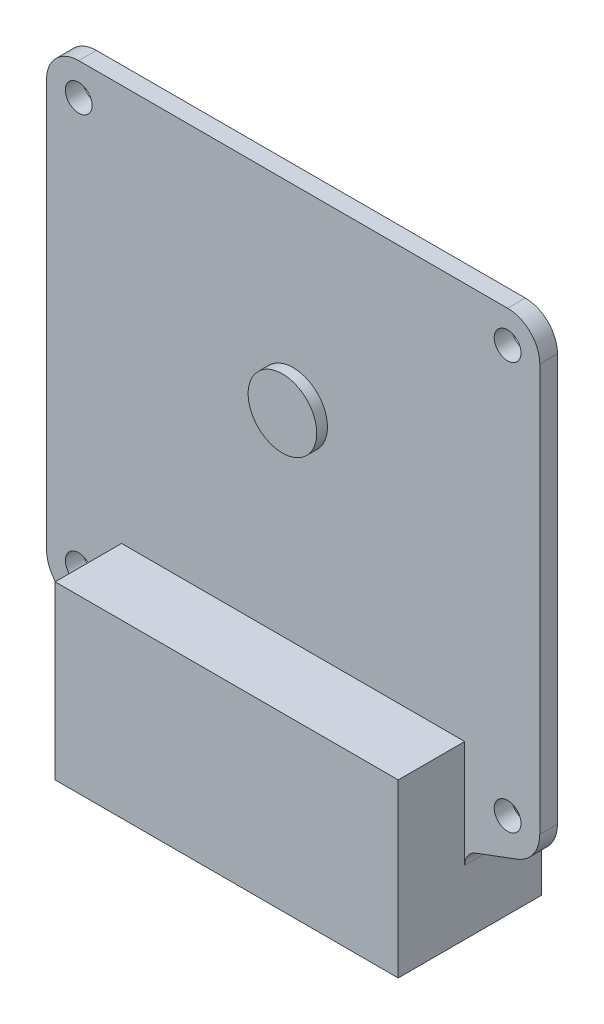
ISO-10303-21;
HEADER;
FILE_DESCRIPTION(('STEP AP214'),'2;1');
FILE_NAME('part.step','',(''),(''),'','','');
FILE_SCHEMA(('AUTOMOTIVE_DESIGN { 1 0 10303 214 1 1 1 1 }'));
ENDSEC;
DATA;
#1=APPLICATION_CONTEXT('core data for automotive mechanical design processes');
#2=APPLICATION_PROTOCOL_DEFINITION('international standard','automotive_design',2000,#1);
#3=PRODUCT_CONTEXT('',#1,'mechanical');
#4=PRODUCT('Part','Part','',(#3));
#5=PRODUCT_RELATED_PRODUCT_CATEGORY('part','',(#4));
#6=PRODUCT_DEFINITION_FORMATION('','',#4);
#7=PRODUCT_DEFINITION_CONTEXT('part definition',#1,'design');
#8=PRODUCT_DEFINITION('design','',#6,#7);
#9=PRODUCT_DEFINITION_SHAPE('','',#8);
#10=(LENGTH_UNIT() NAMED_UNIT(*) SI_UNIT(.MILLI.,.METRE.));
#11=(NAMED_UNIT(*) PLANE_ANGLE_UNIT() SI_UNIT($,.RADIAN.));
#12=(NAMED_UNIT(*) SI_UNIT($,.STERADIAN.) SOLID_ANGLE_UNIT());
#13=UNCERTAINTY_MEASURE_WITH_UNIT(LENGTH_MEASURE(1.E-05),#10,'distance_accuracy_value','');
#14=(GEOMETRIC_REPRESENTATION_CONTEXT(3) GLOBAL_UNCERTAINTY_ASSIGNED_CONTEXT((#13)) GLOBAL_UNIT_ASSIGNED_CONTEXT((#10,
#11,#12)) REPRESENTATION_CONTEXT('',''));
#15=CARTESIAN_POINT('',(0.,0.,0.));
#16=DIRECTION('',(0.,0.,1.));
#17=DIRECTION('',(1.,0.,0.));
#18=AXIS2_PLACEMENT_3D('',#15,#16,#17);
#19=CARTESIAN_POINT('',(-20.,15.,0.));
#20=DIRECTION('',(0.,0.,1.));
#21=DIRECTION('',(1.,0.,0.));
#22=AXIS2_PLACEMENT_3D('',#19,#20,#21);
#23=PLANE('',#22);
#24=CARTESIAN_POINT('',(20.,-23.,0.));
#25=DIRECTION('',(0.,0.,1.));
#26=DIRECTION('',(1.,0.,0.));
#27=AXIS2_PLACEMENT_3D('',#24,#25,#26);
#28=CIRCLE('',#27,1.25);
#29=CARTESIAN_POINT('',(21.25,-23.,0.));
#30=VERTEX_POINT('',#29);
#31=EDGE_CURVE('E248',#30,#30,#28,.T.);
#32=ORIENTED_EDGE('',*,*,#31,.T.);
#33=EDGE_LOOP('',(#32));
#34=FACE_BOUND('',#33,.T.);
#35=CARTESIAN_POINT('',(-20.,-23.,0.));
#36=DIRECTION('',(0.,0.,1.));
#37=DIRECTION('',(1.,0.,0.));
#38=AXIS2_PLACEMENT_3D('',#35,#36,#37);
#39=CIRCLE('',#38,1.25);
#40=CARTESIAN_POINT('',(-18.75,-23.,0.));
#41=VERTEX_POINT('',#40);
#42=EDGE_CURVE('E252',#41,#41,#39,.T.);
#43=ORIENTED_EDGE('',*,*,#42,.T.);
#44=EDGE_LOOP('',(#43));
#45=FACE_BOUND('',#44,.T.);
#46=CARTESIAN_POINT('',(-20.,15.,0.));
#47=DIRECTION('',(0.,0.,1.));
#48=DIRECTION('',(1.,0.,0.));
#49=AXIS2_PLACEMENT_3D('',#46,#47,#48);
#50=CIRCLE('',#49,1.25);
#51=CARTESIAN_POINT('',(-18.75,15.,0.));
#52=VERTEX_POINT('',#51);
#53=EDGE_CURVE('E258',#52,#52,#50,.T.);
#54=ORIENTED_EDGE('',*,*,#53,.T.);
#55=EDGE_LOOP('',(#54));
#56=FACE_BOUND('',#55,.T.);
#57=CARTESIAN_POINT('',(20.,15.,0.));
#58=DIRECTION('',(0.,0.,1.));
#59=DIRECTION('',(1.,0.,0.));
#60=AXIS2_PLACEMENT_3D('',#57,#58,#59);
#61=CIRCLE('',#60,1.25);
#62=CARTESIAN_POINT('',(21.25,15.,0.));
#63=VERTEX_POINT('',#62);
#64=EDGE_CURVE('E264',#63,#63,#61,.T.);
#65=ORIENTED_EDGE('',*,*,#64,.T.);
#66=EDGE_LOOP('',(#65));
#67=FACE_BOUND('',#66,.T.);
#68=DIRECTION('',(0.,-1.,0.));
#69=VECTOR('',#68,1.);
#70=CARTESIAN_POINT('',(16.,-35.,0.));
#71=LINE('',#70,#69);
#72=CARTESIAN_POINT('',(16.,-25.,0.));
#73=VERTEX_POINT('',#72);
#74=CARTESIAN_POINT('',(16.,-29.,0.));
#75=VERTEX_POINT('',#74);
#76=EDGE_CURVE('E60',#73,#75,#71,.T.);
#77=ORIENTED_EDGE('',*,*,#76,.F.);
#78=DIRECTION('',(1.,0.,0.));
#79=VECTOR('',#78,1.);
#80=CARTESIAN_POINT('',(16.,-25.,0.));
#81=LINE('',#80,#79);
#82=CARTESIAN_POINT('',(-16.03,-25.,0.));
#83=VERTEX_POINT('',#82);
#84=EDGE_CURVE('E207',#83,#73,#81,.T.);
#85=ORIENTED_EDGE('',*,*,#84,.F.);
#86=DIRECTION('',(0.,1.,0.));
#87=VECTOR('',#86,1.);
#88=CARTESIAN_POINT('',(-16.03,-35.,0.));
#89=LINE('',#88,#87);
#90=CARTESIAN_POINT('',(-16.03,-28.6906458340348,0.));
#91=VERTEX_POINT('',#90);
#92=EDGE_CURVE('E12',#91,#83,#89,.T.);
#93=ORIENTED_EDGE('',*,*,#92,.F.);
#94=CARTESIAN_POINT('',(-17.61,-29.,0.));
#95=DIRECTION('',(0.,0.,-1.));
#96=DIRECTION('',(1.,0.,0.));
#97=AXIS2_PLACEMENT_3D('',#94,#95,#96);
#98=CIRCLE('',#97,1.61);
#99=CARTESIAN_POINT('',(-17.0470544959532,-27.4916259219035,0.));
#100=VERTEX_POINT('',#99);
#101=EDGE_CURVE('E310',#100,#91,#98,.T.);
#102=ORIENTED_EDGE('',*,*,#101,.F.);
#103=DIRECTION('',(0.936878309376722,-0.349655592575629,0.));
#104=VECTOR('',#103,1.);
#105=CARTESIAN_POINT('',(-20.8733737877223,-26.0635920716619,0.));
#106=LINE('',#105,#104);
#107=CARTESIAN_POINT('',(-20.8733737877223,-26.0635920716619,0.));
#108=VERTEX_POINT('',#107);
#109=EDGE_CURVE('E307',#108,#100,#106,.T.);
#110=ORIENTED_EDGE('',*,*,#109,.F.);
#111=CARTESIAN_POINT('',(-19.73,-23.,0.));
#112=DIRECTION('',(0.,0.,1.));
#113=DIRECTION('',(1.,0.,0.));
#114=AXIS2_PLACEMENT_3D('',#111,#112,#113);
#115=CIRCLE('',#114,3.27);
#116=CARTESIAN_POINT('',(-23.,-23.,0.));
#117=VERTEX_POINT('',#116);
#118=EDGE_CURVE('E305',#117,#108,#115,.T.);
#119=ORIENTED_EDGE('',*,*,#118,.F.);
#120=DIRECTION('',(0.,-1.,0.));
#121=VECTOR('',#120,1.);
#122=CARTESIAN_POINT('',(-23.,15.,0.));
#123=LINE('',#122,#121);
#124=CARTESIAN_POINT('',(-23.,15.,0.));
#125=VERTEX_POINT('',#124);
#126=EDGE_CURVE('E303',#125,#117,#123,.T.);
#127=ORIENTED_EDGE('',*,*,#126,.F.);
#128=CARTESIAN_POINT('',(-20.,15.,0.));
#129=DIRECTION('',(0.,0.,1.));
#130=DIRECTION('',(1.,0.,0.));
#131=AXIS2_PLACEMENT_3D('',#128,#129,#130);
#132=CIRCLE('',#131,3.);
#133=CARTESIAN_POINT('',(-20.,18.,0.));
#134=VERTEX_POINT('',#133);
#135=EDGE_CURVE('E275',#134,#125,#132,.T.);
#136=ORIENTED_EDGE('',*,*,#135,.F.);
#137=DIRECTION('',(-1.,0.,0.));
#138=VECTOR('',#137,1.);
#139=CARTESIAN_POINT('',(-20.,18.,0.));
#140=LINE('',#139,#138);
#141=CARTESIAN_POINT('',(20.,18.,0.));
#142=VERTEX_POINT('',#141);
#143=EDGE_CURVE('E280',#142,#134,#140,.T.);
#144=ORIENTED_EDGE('',*,*,#143,.F.);
#145=CARTESIAN_POINT('',(20.,15.,0.));
#146=DIRECTION('',(0.,0.,1.));
#147=DIRECTION('',(1.,0.,0.));
#148=AXIS2_PLACEMENT_3D('',#145,#146,#147);
#149=CIRCLE('',#148,3.);
#150=CARTESIAN_POINT('',(23.,15.,0.));
#151=VERTEX_POINT('',#150);
#152=EDGE_CURVE('E322',#151,#142,#149,.T.);
#153=ORIENTED_EDGE('',*,*,#152,.F.);
#154=DIRECTION('',(0.,1.,0.));
#155=VECTOR('',#154,1.);
#156=CARTESIAN_POINT('',(23.,15.,0.));
#157=LINE('',#156,#155);
#158=CARTESIAN_POINT('',(23.,-23.,0.));
#159=VERTEX_POINT('',#158);
#160=EDGE_CURVE('E320',#159,#151,#157,.T.);
#161=ORIENTED_EDGE('',*,*,#160,.F.);
#162=CARTESIAN_POINT('',(19.73,-23.,0.));
#163=DIRECTION('',(0.,0.,1.));
#164=DIRECTION('',(-1.,0.,0.));
#165=AXIS2_PLACEMENT_3D('',#162,#163,#164);
#166=CIRCLE('',#165,3.27);
#167=CARTESIAN_POINT('',(20.8733737877223,-26.0635920716619,0.));
#168=VERTEX_POINT('',#167);
#169=EDGE_CURVE('E318',#168,#159,#166,.T.);
#170=ORIENTED_EDGE('',*,*,#169,.F.);
#171=DIRECTION('',(0.936878309376722,0.34965559257563,0.));
#172=VECTOR('',#171,1.);
#173=CARTESIAN_POINT('',(20.8733737877223,-26.0635920716619,0.));
#174=LINE('',#173,#172);
#175=CARTESIAN_POINT('',(17.0470544959532,-27.4916259219035,0.));
#176=VERTEX_POINT('',#175);
#177=EDGE_CURVE('E316',#176,#168,#174,.T.);
#178=ORIENTED_EDGE('',*,*,#177,.F.);
#179=CARTESIAN_POINT('',(17.61,-29.,0.));
#180=DIRECTION('',(0.,0.,-1.));
#181=DIRECTION('',(-1.,0.,0.));
#182=AXIS2_PLACEMENT_3D('',#179,#180,#181);
#183=CIRCLE('',#182,1.61);
#184=EDGE_CURVE('E314',#75,#176,#183,.T.);
#185=ORIENTED_EDGE('',*,*,#184,.F.);
#186=EDGE_LOOP('',(#77,#85,#93,#102,#110,#119,#127,#136,#144,#153,#161,#170,#178,#185));
#187=FACE_BOUND('',#186,.T.);
#188=ADVANCED_FACE('F42',(#34,#45,#56,#67,#187),#23,.F.);
#189=CARTESIAN_POINT('',(-20.,15.,1.65));
#190=DIRECTION('',(0.,0.,1.));
#191=DIRECTION('',(1.,0.,0.));
#192=AXIS2_PLACEMENT_3D('',#189,#190,#191);
#193=PLANE('',#192);
#194=DIRECTION('',(0.,1.,0.));
#195=VECTOR('',#194,1.);
#196=CARTESIAN_POINT('',(16.,-19.,1.65));
#197=LINE('',#196,#195);
#198=CARTESIAN_POINT('',(16.,-29.,1.65));
#199=VERTEX_POINT('',#198);
#200=CARTESIAN_POINT('',(16.,-19.,1.65));
#201=VERTEX_POINT('',#200);
#202=EDGE_CURVE('E51',#199,#201,#197,.T.);
#203=ORIENTED_EDGE('',*,*,#202,.F.);
#204=CARTESIAN_POINT('',(17.61,-29.,1.65));
#205=DIRECTION('',(0.,0.,-1.));
#206=DIRECTION('',(-1.,0.,0.));
#207=AXIS2_PLACEMENT_3D('',#204,#205,#206);
#208=CIRCLE('',#207,1.61);
#209=CARTESIAN_POINT('',(17.0470544959532,-27.4916259219035,1.65));
#210=VERTEX_POINT('',#209);
#211=EDGE_CURVE('E288',#199,#210,#208,.T.);
#212=ORIENTED_EDGE('',*,*,#211,.T.);
#213=DIRECTION('',(0.936878309376722,0.34965559257563,0.));
#214=VECTOR('',#213,1.);
#215=CARTESIAN_POINT('',(20.8733737877223,-26.0635920716619,1.65));
#216=LINE('',#215,#214);
#217=CARTESIAN_POINT('',(20.8733737877223,-26.0635920716619,1.65));
#218=VERTEX_POINT('',#217);
#219=EDGE_CURVE('E290',#210,#218,#216,.T.);
#220=ORIENTED_EDGE('',*,*,#219,.T.);
#221=CARTESIAN_POINT('',(19.73,-23.,1.65));
#222=DIRECTION('',(0.,0.,1.));
#223=DIRECTION('',(-1.,0.,0.));
#224=AXIS2_PLACEMENT_3D('',#221,#222,#223);
#225=CIRCLE('',#224,3.27);
#226=CARTESIAN_POINT('',(23.,-23.,1.65));
#227=VERTEX_POINT('',#226);
#228=EDGE_CURVE('E292',#218,#227,#225,.T.);
#229=ORIENTED_EDGE('',*,*,#228,.T.);
#230=DIRECTION('',(0.,1.,0.));
#231=VECTOR('',#230,1.);
#232=CARTESIAN_POINT('',(23.,15.,1.65));
#233=LINE('',#232,#231);
#234=CARTESIAN_POINT('',(23.,15.,1.65));
#235=VERTEX_POINT('',#234);
#236=EDGE_CURVE('E294',#227,#235,#233,.T.);
#237=ORIENTED_EDGE('',*,*,#236,.T.);
#238=CARTESIAN_POINT('',(20.,15.,1.65));
#239=DIRECTION('',(0.,0.,1.));
#240=DIRECTION('',(1.,0.,0.));
#241=AXIS2_PLACEMENT_3D('',#238,#239,#240);
#242=CIRCLE('',#241,3.);
#243=CARTESIAN_POINT('',(20.,18.,1.65));
#244=VERTEX_POINT('',#243);
#245=EDGE_CURVE('E296',#235,#244,#242,.T.);
#246=ORIENTED_EDGE('',*,*,#245,.T.);
#247=DIRECTION('',(-1.,0.,0.));
#248=VECTOR('',#247,1.);
#249=CARTESIAN_POINT('',(-20.,18.,1.65));
#250=LINE('',#249,#248);
#251=CARTESIAN_POINT('',(-20.,18.,1.65));
#252=VERTEX_POINT('',#251);
#253=EDGE_CURVE('E298',#244,#252,#250,.T.);
#254=ORIENTED_EDGE('',*,*,#253,.T.);
#255=CARTESIAN_POINT('',(-20.,15.,1.65));
#256=DIRECTION('',(0.,0.,1.));
#257=DIRECTION('',(1.,0.,0.));
#258=AXIS2_PLACEMENT_3D('',#255,#256,#257);
#259=CIRCLE('',#258,3.);
#260=CARTESIAN_POINT('',(-23.,15.,1.65));
#261=VERTEX_POINT('',#260);
#262=EDGE_CURVE('E276',#252,#261,#259,.T.);
#263=ORIENTED_EDGE('',*,*,#262,.T.);
#264=DIRECTION('',(0.,-1.,0.));
#265=VECTOR('',#264,1.);
#266=CARTESIAN_POINT('',(-23.,15.,1.65));
#267=LINE('',#266,#265);
#268=CARTESIAN_POINT('',(-23.,-23.,1.65));
#269=VERTEX_POINT('',#268);
#270=EDGE_CURVE('E279',#261,#269,#267,.T.);
#271=ORIENTED_EDGE('',*,*,#270,.T.);
#272=CARTESIAN_POINT('',(-19.73,-23.,1.65));
#273=DIRECTION('',(0.,0.,1.));
#274=DIRECTION('',(1.,0.,0.));
#275=AXIS2_PLACEMENT_3D('',#272,#273,#274);
#276=CIRCLE('',#275,3.27);
#277=CARTESIAN_POINT('',(-20.8733737877223,-26.0635920716619,1.65));
#278=VERTEX_POINT('',#277);
#279=EDGE_CURVE('E282',#269,#278,#276,.T.);
#280=ORIENTED_EDGE('',*,*,#279,.T.);
#281=DIRECTION('',(0.936878309376722,-0.349655592575629,0.));
#282=VECTOR('',#281,1.);
#283=CARTESIAN_POINT('',(-20.8733737877223,-26.0635920716619,1.65));
#284=LINE('',#283,#282);
#285=CARTESIAN_POINT('',(-17.0470544959532,-27.4916259219035,1.65));
#286=VERTEX_POINT('',#285);
#287=EDGE_CURVE('E284',#278,#286,#284,.T.);
#288=ORIENTED_EDGE('',*,*,#287,.T.);
#289=CARTESIAN_POINT('',(-17.61,-29.,1.65));
#290=DIRECTION('',(0.,0.,-1.));
#291=DIRECTION('',(1.,0.,0.));
#292=AXIS2_PLACEMENT_3D('',#289,#290,#291);
#293=CIRCLE('',#292,1.61);
#294=CARTESIAN_POINT('',(-16.,-29.,1.65));
#295=VERTEX_POINT('',#294);
#296=EDGE_CURVE('E286',#286,#295,#293,.T.);
#297=ORIENTED_EDGE('',*,*,#296,.T.);
#298=DIRECTION('',(0.,-1.,0.));
#299=VECTOR('',#298,1.);
#300=CARTESIAN_POINT('',(-16.,-19.,1.65));
#301=LINE('',#300,#299);
#302=CARTESIAN_POINT('',(-16.,-19.,1.65));
#303=VERTEX_POINT('',#302);
#304=EDGE_CURVE('E229',#303,#295,#301,.T.);
#305=ORIENTED_EDGE('',*,*,#304,.F.);
#306=DIRECTION('',(-1.,0.,0.));
#307=VECTOR('',#306,1.);
#308=CARTESIAN_POINT('',(-16.,-19.,1.65));
#309=LINE('',#308,#307);
#310=EDGE_CURVE('E226',#201,#303,#309,.T.);
#311=ORIENTED_EDGE('',*,*,#310,.F.);
#312=EDGE_LOOP('',(#203,#212,#220,#229,#237,#246,#254,#263,#271,#280,#288,#297,#305,#311));
#313=FACE_BOUND('',#312,.T.);
#314=CARTESIAN_POINT('',(-20.,-23.,1.65));
#315=DIRECTION('',(0.,0.,1.));
#316=DIRECTION('',(1.,0.,0.));
#317=AXIS2_PLACEMENT_3D('',#314,#315,#316);
#318=CIRCLE('',#317,1.25);
#319=CARTESIAN_POINT('',(-18.75,-23.,1.65));
#320=VERTEX_POINT('',#319);
#321=EDGE_CURVE('E255',#320,#320,#318,.T.);
#322=ORIENTED_EDGE('',*,*,#321,.F.);
#323=EDGE_LOOP('',(#322));
#324=FACE_BOUND('',#323,.T.);
#325=CARTESIAN_POINT('',(20.,15.,1.65));
#326=DIRECTION('',(0.,0.,1.));
#327=DIRECTION('',(1.,0.,0.));
#328=AXIS2_PLACEMENT_3D('',#325,#326,#327);
#329=CIRCLE('',#328,1.25);
#330=CARTESIAN_POINT('',(21.25,15.,1.65));
#331=VERTEX_POINT('',#330);
#332=EDGE_CURVE('E267',#331,#331,#329,.T.);
#333=ORIENTED_EDGE('',*,*,#332,.F.);
#334=EDGE_LOOP('',(#333));
#335=FACE_BOUND('',#334,.T.);
#336=CARTESIAN_POINT('',(0.,0.,1.65));
#337=DIRECTION('',(0.,0.,1.));
#338=DIRECTION('',(1.,0.,0.));
#339=AXIS2_PLACEMENT_3D('',#336,#337,#338);
#340=CIRCLE('',#339,3.2);
#341=CARTESIAN_POINT('',(3.2,0.,1.65));
#342=VERTEX_POINT('',#341);
#343=EDGE_CURVE('E270',#342,#342,#340,.T.);
#344=ORIENTED_EDGE('',*,*,#343,.F.);
#345=EDGE_LOOP('',(#344));
#346=FACE_BOUND('',#345,.T.);
#347=CARTESIAN_POINT('',(-20.,15.,1.65));
#348=DIRECTION('',(0.,0.,1.));
#349=DIRECTION('',(1.,0.,0.));
#350=AXIS2_PLACEMENT_3D('',#347,#348,#349);
#351=CIRCLE('',#350,1.25);
#352=CARTESIAN_POINT('',(-18.75,15.,1.65));
#353=VERTEX_POINT('',#352);
#354=EDGE_CURVE('E261',#353,#353,#351,.T.);
#355=ORIENTED_EDGE('',*,*,#354,.F.);
#356=EDGE_LOOP('',(#355));
#357=FACE_BOUND('',#356,.T.);
#358=CARTESIAN_POINT('',(20.,-23.,1.65));
#359=DIRECTION('',(0.,0.,1.));
#360=DIRECTION('',(1.,0.,0.));
#361=AXIS2_PLACEMENT_3D('',#358,#359,#360);
#362=CIRCLE('',#361,1.25);
#363=CARTESIAN_POINT('',(21.25,-23.,1.65));
#364=VERTEX_POINT('',#363);
#365=EDGE_CURVE('E249',#364,#364,#362,.T.);
#366=ORIENTED_EDGE('',*,*,#365,.F.);
#367=EDGE_LOOP('',(#366));
#368=FACE_BOUND('',#367,.T.);
#369=ADVANCED_FACE('F377',(#313,#324,#335,#346,#357,#368),#193,.T.);
#370=CARTESIAN_POINT('',(-20.,15.,1.65));
#371=DIRECTION('',(0.,0.,-1.));
#372=DIRECTION('',(-1.,0.,0.));
#373=AXIS2_PLACEMENT_3D('',#370,#371,#372);
#374=CYLINDRICAL_SURFACE('',#373,3.);
#375=ORIENTED_EDGE('',*,*,#135,.T.);
#376=DIRECTION('',(0.,0.,-1.));
#377=VECTOR('',#376,1.);
#378=CARTESIAN_POINT('',(-23.,15.,1.65));
#379=LINE('',#378,#377);
#380=EDGE_CURVE('E46',#261,#125,#379,.T.);
#381=ORIENTED_EDGE('',*,*,#380,.F.);
#382=ORIENTED_EDGE('',*,*,#262,.F.);
#383=DIRECTION('',(0.,0.,-1.));
#384=VECTOR('',#383,1.);
#385=CARTESIAN_POINT('',(-20.,18.,1.65));
#386=LINE('',#385,#384);
#387=EDGE_CURVE('E300',#252,#134,#386,.T.);
#388=ORIENTED_EDGE('',*,*,#387,.T.);
#389=EDGE_LOOP('',(#375,#381,#382,#388));
#390=FACE_BOUND('',#389,.T.);
#391=ADVANCED_FACE('F44',(#390),#374,.T.);
#392=CARTESIAN_POINT('',(-23.,15.,1.65));
#393=DIRECTION('',(1.,0.,0.));
#394=DIRECTION('',(0.,1.,0.));
#395=AXIS2_PLACEMENT_3D('',#392,#393,#394);
#396=PLANE('',#395);
#397=ORIENTED_EDGE('',*,*,#126,.T.);
#398=DIRECTION('',(0.,0.,-1.));
#399=VECTOR('',#398,1.);
#400=CARTESIAN_POINT('',(-23.,-23.,1.65));
#401=LINE('',#400,#399);
#402=EDGE_CURVE('E352',#269,#117,#401,.T.);
#403=ORIENTED_EDGE('',*,*,#402,.F.);
#404=ORIENTED_EDGE('',*,*,#270,.F.);
#405=ORIENTED_EDGE('',*,*,#380,.T.);
#406=EDGE_LOOP('',(#397,#403,#404,#405));
#407=FACE_BOUND('',#406,.T.);
#408=ADVANCED_FACE('F361',(#407),#396,.F.);
#409=CARTESIAN_POINT('',(-19.73,-23.,1.65));
#410=DIRECTION('',(0.,0.,-1.));
#411=DIRECTION('',(-1.,0.,0.));
#412=AXIS2_PLACEMENT_3D('',#409,#410,#411);
#413=CYLINDRICAL_SURFACE('',#412,3.27);
#414=ORIENTED_EDGE('',*,*,#118,.T.);
#415=DIRECTION('',(0.,0.,-1.));
#416=VECTOR('',#415,1.);
#417=CARTESIAN_POINT('',(-20.8733737877223,-26.0635920716619,1.65));
#418=LINE('',#417,#416);
#419=EDGE_CURVE('E350',#278,#108,#418,.T.);
#420=ORIENTED_EDGE('',*,*,#419,.F.);
#421=ORIENTED_EDGE('',*,*,#279,.F.);
#422=ORIENTED_EDGE('',*,*,#402,.T.);
#423=EDGE_LOOP('',(#414,#420,#421,#422));
#424=FACE_BOUND('',#423,.T.);
#425=ADVANCED_FACE('F370',(#424),#413,.T.);
#426=CARTESIAN_POINT('',(-20.8733737877223,-26.0635920716619,1.65));
#427=DIRECTION('',(0.349655592575629,0.936878309376722,0.));
#428=DIRECTION('',(-0.936878309376722,0.349655592575629,0.));
#429=AXIS2_PLACEMENT_3D('',#426,#427,#428);
#430=PLANE('',#429);
#431=ORIENTED_EDGE('',*,*,#109,.T.);
#432=DIRECTION('',(0.,0.,-1.));
#433=VECTOR('',#432,1.);
#434=CARTESIAN_POINT('',(-17.0470544959532,-27.4916259219035,1.65));
#435=LINE('',#434,#433);
#436=EDGE_CURVE('E347',#286,#100,#435,.T.);
#437=ORIENTED_EDGE('',*,*,#436,.F.);
#438=ORIENTED_EDGE('',*,*,#287,.F.);
#439=ORIENTED_EDGE('',*,*,#419,.T.);
#440=EDGE_LOOP('',(#431,#437,#438,#439));
#441=FACE_BOUND('',#440,.T.);
#442=ADVANCED_FACE('F373',(#441),#430,.F.);
#443=CARTESIAN_POINT('',(-17.61,-29.,1.65));
#444=DIRECTION('',(0.,0.,-1.));
#445=DIRECTION('',(-1.,0.,0.));
#446=AXIS2_PLACEMENT_3D('',#443,#444,#445);
#447=CYLINDRICAL_SURFACE('',#446,1.61);
#448=ORIENTED_EDGE('',*,*,#101,.T.);
#449=CARTESIAN_POINT('',(-16.,-29.,0.));
#450=VERTEX_POINT('',#449);
#451=EDGE_CURVE('E309',#91,#450,#98,.T.);
#452=ORIENTED_EDGE('',*,*,#451,.T.);
#453=DIRECTION('',(0.,0.,-1.));
#454=VECTOR('',#453,1.);
#455=CARTESIAN_POINT('',(-16.,-29.,1.65));
#456=LINE('',#455,#454);
#457=EDGE_CURVE('E344',#295,#450,#456,.T.);
#458=ORIENTED_EDGE('',*,*,#457,.F.);
#459=ORIENTED_EDGE('',*,*,#296,.F.);
#460=ORIENTED_EDGE('',*,*,#436,.T.);
#461=EDGE_LOOP('',(#448,#452,#458,#459,#460));
#462=FACE_BOUND('',#461,.T.);
#463=ADVANCED_FACE('F418',(#462),#447,.F.);
#464=CARTESIAN_POINT('',(-16.,-35.,1.65));
#465=DIRECTION('',(1.,0.,0.));
#466=DIRECTION('',(0.,0.,-1.));
#467=AXIS2_PLACEMENT_3D('',#464,#465,#466);
#468=PLANE('',#467);
#469=DIRECTION('',(0.,-1.,0.));
#470=VECTOR('',#469,1.);
#471=CARTESIAN_POINT('',(-16.,-35.,0.));
#472=LINE('',#471,#470);
#473=CARTESIAN_POINT('',(-16.,-35.,0.));
#474=VERTEX_POINT('',#473);
#475=EDGE_CURVE('E312',#450,#474,#472,.T.);
#476=ORIENTED_EDGE('',*,*,#475,.T.);
#477=DIRECTION('',(0.,0.,-1.));
#478=VECTOR('',#477,1.);
#479=CARTESIAN_POINT('',(-16.,-35.,1.65));
#480=LINE('',#479,#478);
#481=CARTESIAN_POINT('',(-16.,-35.,7.85));
#482=VERTEX_POINT('',#481);
#483=EDGE_CURVE('E190',#482,#474,#480,.T.);
#484=ORIENTED_EDGE('',*,*,#483,.F.);
#485=DIRECTION('',(0.,-1.,0.));
#486=VECTOR('',#485,1.);
#487=CARTESIAN_POINT('',(-16.,-19.,7.85));
#488=LINE('',#487,#486);
#489=CARTESIAN_POINT('',(-16.,-19.,7.85));
#490=VERTEX_POINT('',#489);
#491=EDGE_CURVE('E231',#490,#482,#488,.T.);
#492=ORIENTED_EDGE('',*,*,#491,.F.);
#493=DIRECTION('',(0.,0.,-1.));
#494=VECTOR('',#493,1.);
#495=CARTESIAN_POINT('',(-16.,-19.,7.85));
#496=LINE('',#495,#494);
#497=EDGE_CURVE('E236',#490,#303,#496,.T.);
#498=ORIENTED_EDGE('',*,*,#497,.T.);
#499=ORIENTED_EDGE('',*,*,#304,.T.);
#500=ORIENTED_EDGE('',*,*,#457,.T.);
#501=EDGE_LOOP('',(#476,#484,#492,#498,#499,#500));
#502=FACE_BOUND('',#501,.T.);
#503=ADVANCED_FACE('F420',(#502),#468,.F.);
#504=CARTESIAN_POINT('',(-16.,-35.,1.65));
#505=DIRECTION('',(0.,1.,0.));
#506=DIRECTION('',(0.,0.,1.));
#507=AXIS2_PLACEMENT_3D('',#504,#505,#506);
#508=PLANE('',#507);
#509=ORIENTED_EDGE('',*,*,#483,.T.);
#510=DIRECTION('',(-1.,0.,0.));
#511=VECTOR('',#510,1.);
#512=CARTESIAN_POINT('',(16.,-35.,0.));
#513=LINE('',#512,#511);
#514=CARTESIAN_POINT('',(-16.03,-35.,0.));
#515=VERTEX_POINT('',#514);
#516=EDGE_CURVE('E215',#474,#515,#513,.T.);
#517=ORIENTED_EDGE('',*,*,#516,.T.);
#518=DIRECTION('',(0.,0.,1.));
#519=VECTOR('',#518,1.);
#520=CARTESIAN_POINT('',(-16.03,-35.,-5.5));
#521=LINE('',#520,#519);
#522=CARTESIAN_POINT('',(-16.03,-35.,-5.5));
#523=VERTEX_POINT('',#522);
#524=EDGE_CURVE('E198',#523,#515,#521,.T.);
#525=ORIENTED_EDGE('',*,*,#524,.F.);
#526=DIRECTION('',(-1.,0.,0.));
#527=VECTOR('',#526,1.);
#528=CARTESIAN_POINT('',(16.,-35.,-5.5));
#529=LINE('',#528,#527);
#530=CARTESIAN_POINT('',(16.,-35.,-5.5));
#531=VERTEX_POINT('',#530);
#532=EDGE_CURVE('E194',#531,#523,#529,.T.);
#533=ORIENTED_EDGE('',*,*,#532,.F.);
#534=DIRECTION('',(0.,0.,-1.));
#535=VECTOR('',#534,1.);
#536=CARTESIAN_POINT('',(16.,-35.,1.65));
#537=LINE('',#536,#535);
#538=CARTESIAN_POINT('',(16.,-35.,7.85));
#539=VERTEX_POINT('',#538);
#540=EDGE_CURVE('E178',#539,#531,#537,.T.);
#541=ORIENTED_EDGE('',*,*,#540,.F.);
#542=DIRECTION('',(1.,0.,0.));
#543=VECTOR('',#542,1.);
#544=CARTESIAN_POINT('',(-16.,-35.,7.85));
#545=LINE('',#544,#543);
#546=EDGE_CURVE('E234',#482,#539,#545,.T.);
#547=ORIENTED_EDGE('',*,*,#546,.F.);
#548=EDGE_LOOP('',(#509,#517,#525,#533,#541,#547));
#549=FACE_BOUND('',#548,.T.);
#550=ADVANCED_FACE('F196',(#549),#508,.F.);
#551=CARTESIAN_POINT('',(16.,-35.,1.65));
#552=DIRECTION('',(-1.,0.,0.));
#553=DIRECTION('',(0.,-1.,0.));
#554=AXIS2_PLACEMENT_3D('',#551,#552,#553);
#555=PLANE('',#554);
#556=ORIENTED_EDGE('',*,*,#540,.T.);
#557=DIRECTION('',(0.,-1.,0.));
#558=VECTOR('',#557,1.);
#559=CARTESIAN_POINT('',(16.,-35.,-5.5));
#560=LINE('',#559,#558);
#561=CARTESIAN_POINT('',(16.,-25.,-5.5));
#562=VERTEX_POINT('',#561);
#563=EDGE_CURVE('E183',#562,#531,#560,.T.);
#564=ORIENTED_EDGE('',*,*,#563,.F.);
#565=DIRECTION('',(0.,0.,1.));
#566=VECTOR('',#565,1.);
#567=CARTESIAN_POINT('',(16.,-25.,-5.5));
#568=LINE('',#567,#566);
#569=EDGE_CURVE('E213',#562,#73,#568,.T.);
#570=ORIENTED_EDGE('',*,*,#569,.T.);
#571=ORIENTED_EDGE('',*,*,#76,.T.);
#572=DIRECTION('',(0.,0.,-1.));
#573=VECTOR('',#572,1.);
#574=CARTESIAN_POINT('',(16.,-29.,1.65));
#575=LINE('',#574,#573);
#576=EDGE_CURVE('E191',#199,#75,#575,.T.);
#577=ORIENTED_EDGE('',*,*,#576,.F.);
#578=ORIENTED_EDGE('',*,*,#202,.T.);
#579=DIRECTION('',(0.,0.,-1.));
#580=VECTOR('',#579,1.);
#581=CARTESIAN_POINT('',(16.,-19.,7.85));
#582=LINE('',#581,#580);
#583=CARTESIAN_POINT('',(16.,-19.,7.85));
#584=VERTEX_POINT('',#583);
#585=EDGE_CURVE('E245',#584,#201,#582,.T.);
#586=ORIENTED_EDGE('',*,*,#585,.F.);
#587=DIRECTION('',(0.,1.,0.));
#588=VECTOR('',#587,1.);
#589=CARTESIAN_POINT('',(16.,-19.,7.85));
#590=LINE('',#589,#588);
#591=EDGE_CURVE('E186',#539,#584,#590,.T.);
#592=ORIENTED_EDGE('',*,*,#591,.F.);
#593=EDGE_LOOP('',(#556,#564,#570,#571,#577,#578,#586,#592));
#594=FACE_BOUND('',#593,.T.);
#595=ADVANCED_FACE('F180',(#594),#555,.F.);
#596=CARTESIAN_POINT('',(17.61,-29.,1.65));
#597=DIRECTION('',(0.,0.,-1.));
#598=DIRECTION('',(-1.,0.,0.));
#599=AXIS2_PLACEMENT_3D('',#596,#597,#598);
#600=CYLINDRICAL_SURFACE('',#599,1.61);
#601=ORIENTED_EDGE('',*,*,#184,.T.);
#602=DIRECTION('',(0.,0.,-1.));
#603=VECTOR('',#602,1.);
#604=CARTESIAN_POINT('',(17.0470544959532,-27.4916259219035,1.65));
#605=LINE('',#604,#603);
#606=EDGE_CURVE('E339',#210,#176,#605,.T.);
#607=ORIENTED_EDGE('',*,*,#606,.F.);
#608=ORIENTED_EDGE('',*,*,#211,.F.);
#609=ORIENTED_EDGE('',*,*,#576,.T.);
#610=EDGE_LOOP('',(#601,#607,#608,#609));
#611=FACE_BOUND('',#610,.T.);
#612=ADVANCED_FACE('F425',(#611),#600,.F.);
#613=CARTESIAN_POINT('',(20.8733737877223,-26.0635920716619,1.65));
#614=DIRECTION('',(-0.34965559257563,0.936878309376722,0.));
#615=DIRECTION('',(-0.936878309376722,-0.34965559257563,0.));
#616=AXIS2_PLACEMENT_3D('',#613,#614,#615);
#617=PLANE('',#616);
#618=ORIENTED_EDGE('',*,*,#177,.T.);
#619=DIRECTION('',(0.,0.,-1.));
#620=VECTOR('',#619,1.);
#621=CARTESIAN_POINT('',(20.8733737877223,-26.0635920716619,1.65));
#622=LINE('',#621,#620);
#623=EDGE_CURVE('E336',#218,#168,#622,.T.);
#624=ORIENTED_EDGE('',*,*,#623,.F.);
#625=ORIENTED_EDGE('',*,*,#219,.F.);
#626=ORIENTED_EDGE('',*,*,#606,.T.);
#627=EDGE_LOOP('',(#618,#624,#625,#626));
#628=FACE_BOUND('',#627,.T.);
#629=ADVANCED_FACE('F401',(#628),#617,.F.);
#630=CARTESIAN_POINT('',(19.73,-23.,1.65));
#631=DIRECTION('',(0.,0.,-1.));
#632=DIRECTION('',(-1.,0.,0.));
#633=AXIS2_PLACEMENT_3D('',#630,#631,#632);
#634=CYLINDRICAL_SURFACE('',#633,3.27);
#635=ORIENTED_EDGE('',*,*,#169,.T.);
#636=DIRECTION('',(0.,0.,-1.));
#637=VECTOR('',#636,1.);
#638=CARTESIAN_POINT('',(23.,-23.,1.65));
#639=LINE('',#638,#637);
#640=EDGE_CURVE('E333',#227,#159,#639,.T.);
#641=ORIENTED_EDGE('',*,*,#640,.F.);
#642=ORIENTED_EDGE('',*,*,#228,.F.);
#643=ORIENTED_EDGE('',*,*,#623,.T.);
#644=EDGE_LOOP('',(#635,#641,#642,#643));
#645=FACE_BOUND('',#644,.T.);
#646=ADVANCED_FACE('F397',(#645),#634,.T.);
#647=CARTESIAN_POINT('',(23.,15.,1.65));
#648=DIRECTION('',(-1.,0.,0.));
#649=DIRECTION('',(0.,-1.,0.));
#650=AXIS2_PLACEMENT_3D('',#647,#648,#649);
#651=PLANE('',#650);
#652=ORIENTED_EDGE('',*,*,#160,.T.);
#653=DIRECTION('',(0.,0.,-1.));
#654=VECTOR('',#653,1.);
#655=CARTESIAN_POINT('',(23.,15.,1.65));
#656=LINE('',#655,#654);
#657=EDGE_CURVE('E330',#235,#151,#656,.T.);
#658=ORIENTED_EDGE('',*,*,#657,.F.);
#659=ORIENTED_EDGE('',*,*,#236,.F.);
#660=ORIENTED_EDGE('',*,*,#640,.T.);
#661=EDGE_LOOP('',(#652,#658,#659,#660));
#662=FACE_BOUND('',#661,.T.);
#663=ADVANCED_FACE('F392',(#662),#651,.F.);
#664=CARTESIAN_POINT('',(20.,15.,1.65));
#665=DIRECTION('',(0.,0.,-1.));
#666=DIRECTION('',(-1.,0.,0.));
#667=AXIS2_PLACEMENT_3D('',#664,#665,#666);
#668=CYLINDRICAL_SURFACE('',#667,3.);
#669=ORIENTED_EDGE('',*,*,#152,.T.);
#670=DIRECTION('',(0.,0.,-1.));
#671=VECTOR('',#670,1.);
#672=CARTESIAN_POINT('',(20.,18.,1.65));
#673=LINE('',#672,#671);
#674=EDGE_CURVE('E327',#244,#142,#673,.T.);
#675=ORIENTED_EDGE('',*,*,#674,.F.);
#676=ORIENTED_EDGE('',*,*,#245,.F.);
#677=ORIENTED_EDGE('',*,*,#657,.T.);
#678=EDGE_LOOP('',(#669,#675,#676,#677));
#679=FACE_BOUND('',#678,.T.);
#680=ADVANCED_FACE('F386',(#679),#668,.T.);
#681=CARTESIAN_POINT('',(-20.,18.,1.65));
#682=DIRECTION('',(0.,-1.,0.));
#683=DIRECTION('',(0.,0.,-1.));
#684=AXIS2_PLACEMENT_3D('',#681,#682,#683);
#685=PLANE('',#684);
#686=ORIENTED_EDGE('',*,*,#143,.T.);
#687=ORIENTED_EDGE('',*,*,#387,.F.);
#688=ORIENTED_EDGE('',*,*,#253,.F.);
#689=ORIENTED_EDGE('',*,*,#674,.T.);
#690=EDGE_LOOP('',(#686,#687,#688,#689));
#691=FACE_BOUND('',#690,.T.);
#692=ADVANCED_FACE('F384',(#691),#685,.F.);
#693=CARTESIAN_POINT('',(20.,15.,1.65));
#694=DIRECTION('',(0.,0.,-1.));
#695=DIRECTION('',(-1.,0.,0.));
#696=AXIS2_PLACEMENT_3D('',#693,#694,#695);
#697=CYLINDRICAL_SURFACE('',#696,1.25);
#698=ORIENTED_EDGE('',*,*,#332,.T.);
#699=EDGE_LOOP('',(#698));
#700=FACE_BOUND('',#699,.T.);
#701=ORIENTED_EDGE('',*,*,#64,.F.);
#702=EDGE_LOOP('',(#701));
#703=FACE_BOUND('',#702,.T.);
#704=ADVANCED_FACE('F448',(#700,#703),#697,.F.);
#705=CARTESIAN_POINT('',(-20.,15.,1.65));
#706=DIRECTION('',(0.,0.,-1.));
#707=DIRECTION('',(-1.,0.,0.));
#708=AXIS2_PLACEMENT_3D('',#705,#706,#707);
#709=CYLINDRICAL_SURFACE('',#708,1.25);
#710=ORIENTED_EDGE('',*,*,#354,.T.);
#711=EDGE_LOOP('',(#710));
#712=FACE_BOUND('',#711,.T.);
#713=ORIENTED_EDGE('',*,*,#53,.F.);
#714=EDGE_LOOP('',(#713));
#715=FACE_BOUND('',#714,.T.);
#716=ADVANCED_FACE('F476',(#712,#715),#709,.F.);
#717=CARTESIAN_POINT('',(-20.,-23.,1.65));
#718=DIRECTION('',(0.,0.,-1.));
#719=DIRECTION('',(-1.,0.,0.));
#720=AXIS2_PLACEMENT_3D('',#717,#718,#719);
#721=CYLINDRICAL_SURFACE('',#720,1.25);
#722=ORIENTED_EDGE('',*,*,#321,.T.);
#723=EDGE_LOOP('',(#722));
#724=FACE_BOUND('',#723,.T.);
#725=ORIENTED_EDGE('',*,*,#42,.F.);
#726=EDGE_LOOP('',(#725));
#727=FACE_BOUND('',#726,.T.);
#728=ADVANCED_FACE('F483',(#724,#727),#721,.F.);
#729=CARTESIAN_POINT('',(20.,-23.,1.65));
#730=DIRECTION('',(0.,0.,-1.));
#731=DIRECTION('',(-1.,0.,0.));
#732=AXIS2_PLACEMENT_3D('',#729,#730,#731);
#733=CYLINDRICAL_SURFACE('',#732,1.25);
#734=ORIENTED_EDGE('',*,*,#365,.T.);
#735=EDGE_LOOP('',(#734));
#736=FACE_BOUND('',#735,.T.);
#737=ORIENTED_EDGE('',*,*,#31,.F.);
#738=EDGE_LOOP('',(#737));
#739=FACE_BOUND('',#738,.T.);
#740=ADVANCED_FACE('F491',(#736,#739),#733,.F.);
#741=CARTESIAN_POINT('',(-16.,-19.,7.85));
#742=DIRECTION('',(0.,-1.,0.));
#743=DIRECTION('',(0.,0.,-1.));
#744=AXIS2_PLACEMENT_3D('',#741,#742,#743);
#745=PLANE('',#744);
#746=ORIENTED_EDGE('',*,*,#310,.T.);
#747=ORIENTED_EDGE('',*,*,#497,.F.);
#748=DIRECTION('',(-1.,0.,0.));
#749=VECTOR('',#748,1.);
#750=CARTESIAN_POINT('',(-16.,-19.,7.85));
#751=LINE('',#750,#749);
#752=EDGE_CURVE('E228',#584,#490,#751,.T.);
#753=ORIENTED_EDGE('',*,*,#752,.F.);
#754=ORIENTED_EDGE('',*,*,#585,.T.);
#755=EDGE_LOOP('',(#746,#747,#753,#754));
#756=FACE_BOUND('',#755,.T.);
#757=ADVANCED_FACE('F424',(#756),#745,.F.);
#758=CARTESIAN_POINT('',(0.,0.,7.85));
#759=DIRECTION('',(0.,0.,1.));
#760=DIRECTION('',(1.,0.,0.));
#761=AXIS2_PLACEMENT_3D('',#758,#759,#760);
#762=PLANE('',#761);
#763=ORIENTED_EDGE('',*,*,#591,.T.);
#764=ORIENTED_EDGE('',*,*,#752,.T.);
#765=ORIENTED_EDGE('',*,*,#491,.T.);
#766=ORIENTED_EDGE('',*,*,#546,.T.);
#767=EDGE_LOOP('',(#763,#764,#765,#766));
#768=FACE_BOUND('',#767,.T.);
#769=ADVANCED_FACE('F507',(#768),#762,.T.);
#770=CARTESIAN_POINT('',(0.,0.,12.7009667991878));
#771=DIRECTION('',(0.,0.,-1.));
#772=DIRECTION('',(-1.,0.,0.));
#773=AXIS2_PLACEMENT_3D('',#770,#771,#772);
#774=CYLINDRICAL_SURFACE('',#773,3.2);
#775=ORIENTED_EDGE('',*,*,#343,.T.);
#776=EDGE_LOOP('',(#775));
#777=FACE_BOUND('',#776,.T.);
#778=CARTESIAN_POINT('',(0.,0.,2.65));
#779=DIRECTION('',(0.,0.,1.));
#780=DIRECTION('',(1.,0.,0.));
#781=AXIS2_PLACEMENT_3D('',#778,#779,#780);
#782=CIRCLE('',#781,3.2);
#783=CARTESIAN_POINT('',(3.2,0.,2.65));
#784=VERTEX_POINT('',#783);
#785=EDGE_CURVE('E223',#784,#784,#782,.T.);
#786=ORIENTED_EDGE('',*,*,#785,.F.);
#787=EDGE_LOOP('',(#786));
#788=FACE_BOUND('',#787,.T.);
#789=ADVANCED_FACE('F514',(#777,#788),#774,.T.);
#790=CARTESIAN_POINT('',(-20.,15.,2.65));
#791=DIRECTION('',(0.,0.,1.));
#792=DIRECTION('',(1.,0.,0.));
#793=AXIS2_PLACEMENT_3D('',#790,#791,#792);
#794=PLANE('',#793);
#795=ORIENTED_EDGE('',*,*,#785,.T.);
#796=EDGE_LOOP('',(#795));
#797=FACE_BOUND('',#796,.T.);
#798=ADVANCED_FACE('F522',(#797),#794,.T.);
#799=CARTESIAN_POINT('',(0.,0.,0.));
#800=DIRECTION('',(0.,0.,1.));
#801=DIRECTION('',(1.,0.,0.));
#802=AXIS2_PLACEMENT_3D('',#799,#800,#801);
#803=PLANE('',#802);
#804=ORIENTED_EDGE('',*,*,#475,.F.);
#805=ORIENTED_EDGE('',*,*,#451,.F.);
#806=EDGE_CURVE('E53',#515,#91,#89,.T.);
#807=ORIENTED_EDGE('',*,*,#806,.F.);
#808=ORIENTED_EDGE('',*,*,#516,.F.);
#809=EDGE_LOOP('',(#804,#805,#807,#808));
#810=FACE_BOUND('',#809,.T.);
#811=ADVANCED_FACE('F416',(#810),#803,.T.);
#812=CARTESIAN_POINT('',(-16.03,-35.,-5.5));
#813=DIRECTION('',(1.,0.,0.));
#814=DIRECTION('',(0.,0.,-1.));
#815=AXIS2_PLACEMENT_3D('',#812,#813,#814);
#816=PLANE('',#815);
#817=ORIENTED_EDGE('',*,*,#806,.T.);
#818=ORIENTED_EDGE('',*,*,#92,.T.);
#819=DIRECTION('',(0.,0.,1.));
#820=VECTOR('',#819,1.);
#821=CARTESIAN_POINT('',(-16.03,-25.,-5.5));
#822=LINE('',#821,#820);
#823=CARTESIAN_POINT('',(-16.03,-25.,-5.5));
#824=VERTEX_POINT('',#823);
#825=EDGE_CURVE('E219',#824,#83,#822,.T.);
#826=ORIENTED_EDGE('',*,*,#825,.F.);
#827=DIRECTION('',(0.,1.,0.));
#828=VECTOR('',#827,1.);
#829=CARTESIAN_POINT('',(-16.03,-35.,-5.5));
#830=LINE('',#829,#828);
#831=EDGE_CURVE('E201',#523,#824,#830,.T.);
#832=ORIENTED_EDGE('',*,*,#831,.F.);
#833=ORIENTED_EDGE('',*,*,#524,.T.);
#834=EDGE_LOOP('',(#817,#818,#826,#832,#833));
#835=FACE_BOUND('',#834,.T.);
#836=ADVANCED_FACE('F410',(#835),#816,.F.);
#837=CARTESIAN_POINT('',(16.,-25.,-5.5));
#838=DIRECTION('',(0.,-1.,0.));
#839=DIRECTION('',(0.,0.,-1.));
#840=AXIS2_PLACEMENT_3D('',#837,#838,#839);
#841=PLANE('',#840);
#842=ORIENTED_EDGE('',*,*,#84,.T.);
#843=ORIENTED_EDGE('',*,*,#569,.F.);
#844=DIRECTION('',(1.,0.,0.));
#845=VECTOR('',#844,1.);
#846=CARTESIAN_POINT('',(16.,-25.,-5.5));
#847=LINE('',#846,#845);
#848=EDGE_CURVE('E205',#824,#562,#847,.T.);
#849=ORIENTED_EDGE('',*,*,#848,.F.);
#850=ORIENTED_EDGE('',*,*,#825,.T.);
#851=EDGE_LOOP('',(#842,#843,#849,#850));
#852=FACE_BOUND('',#851,.T.);
#853=ADVANCED_FACE('F407',(#852),#841,.F.);
#854=CARTESIAN_POINT('',(0.,0.,-5.5));
#855=DIRECTION('',(0.,0.,1.));
#856=DIRECTION('',(1.,0.,0.));
#857=AXIS2_PLACEMENT_3D('',#854,#855,#856);
#858=PLANE('',#857);
#859=ORIENTED_EDGE('',*,*,#563,.T.);
#860=ORIENTED_EDGE('',*,*,#532,.T.);
#861=ORIENTED_EDGE('',*,*,#831,.T.);
#862=ORIENTED_EDGE('',*,*,#848,.T.);
#863=EDGE_LOOP('',(#859,#860,#861,#862));
#864=FACE_BOUND('',#863,.T.);
#865=ADVANCED_FACE('F203',(#864),#858,.F.);
#866=CLOSED_SHELL('',(#188,#369,#391,#408,#425,#442,#463,#503,#550,#595,#612,#629,#646,#663,
#680,#692,#704,#716,#728,#740,#757,#769,#789,#798,#811,#836,#853,#865));
#867=MANIFOLD_SOLID_BREP('B2',#866);
#868=ADVANCED_BREP_SHAPE_REPRESENTATION('',(#18,#867),#14);
#869=SHAPE_DEFINITION_REPRESENTATION(#9,#868);
ENDSEC;
END-ISO-10303-21;
